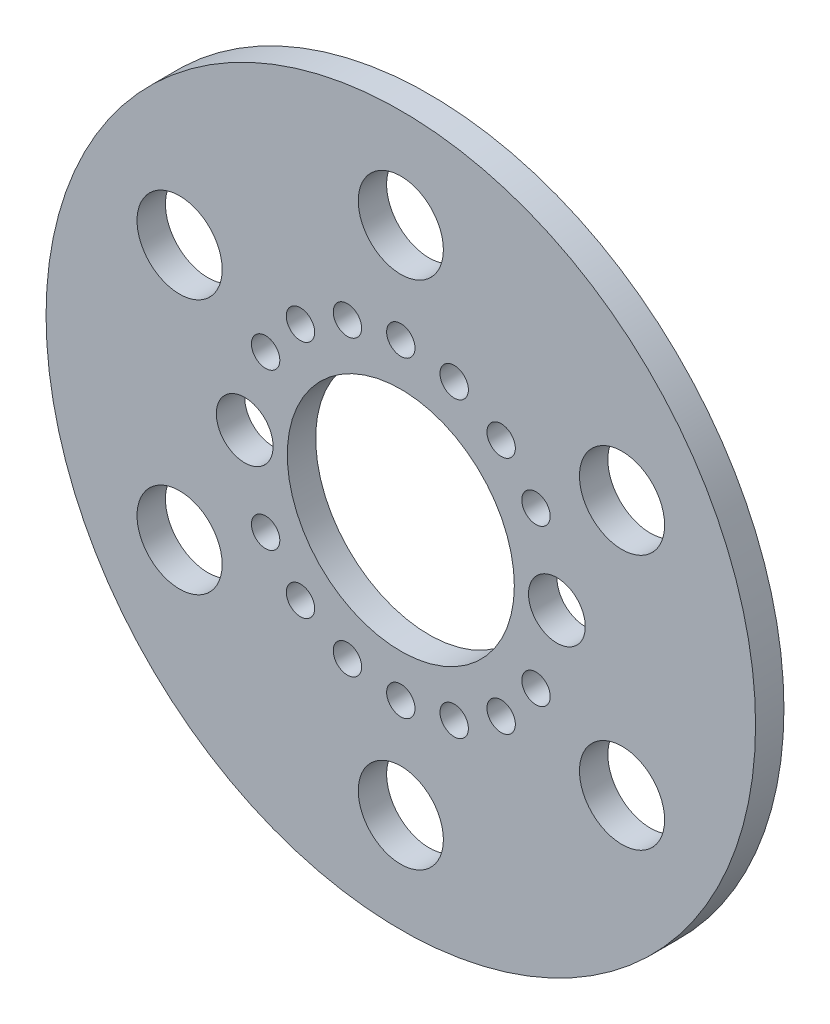
ISO-10303-21;
HEADER;
FILE_DESCRIPTION(('STEP AP214'),'2;1');
FILE_NAME('part.step','',(''),(''),'','','');
FILE_SCHEMA(('AUTOMOTIVE_DESIGN { 1 0 10303 214 1 1 1 1 }'));
ENDSEC;
DATA;
#1=APPLICATION_CONTEXT('core data for automotive mechanical design processes');
#2=APPLICATION_PROTOCOL_DEFINITION('international standard','automotive_design',2000,#1);
#3=PRODUCT_CONTEXT('',#1,'mechanical');
#4=PRODUCT('Part','Part','',(#3));
#5=PRODUCT_RELATED_PRODUCT_CATEGORY('part','',(#4));
#6=PRODUCT_DEFINITION_FORMATION('','',#4);
#7=PRODUCT_DEFINITION_CONTEXT('part definition',#1,'design');
#8=PRODUCT_DEFINITION('design','',#6,#7);
#9=PRODUCT_DEFINITION_SHAPE('','',#8);
#10=(LENGTH_UNIT() NAMED_UNIT(*) SI_UNIT(.MILLI.,.METRE.));
#11=(NAMED_UNIT(*) PLANE_ANGLE_UNIT() SI_UNIT($,.RADIAN.));
#12=(NAMED_UNIT(*) SI_UNIT($,.STERADIAN.) SOLID_ANGLE_UNIT());
#13=UNCERTAINTY_MEASURE_WITH_UNIT(LENGTH_MEASURE(1.E-05),#10,'distance_accuracy_value','');
#14=(GEOMETRIC_REPRESENTATION_CONTEXT(3) GLOBAL_UNCERTAINTY_ASSIGNED_CONTEXT((#13)) GLOBAL_UNIT_ASSIGNED_CONTEXT((#10,
#11,#12)) REPRESENTATION_CONTEXT('',''));
#15=CARTESIAN_POINT('',(0.,0.,0.));
#16=DIRECTION('',(0.,0.,1.));
#17=DIRECTION('',(1.,0.,0.));
#18=AXIS2_PLACEMENT_3D('',#15,#16,#17);
#19=CARTESIAN_POINT('',(0.,0.,1.));
#20=DIRECTION('',(0.,0.,1.));
#21=DIRECTION('',(1.,0.,0.));
#22=AXIS2_PLACEMENT_3D('',#19,#20,#21);
#23=PLANE('',#22);
#24=CARTESIAN_POINT('',(-3.53533185327562,4.21324443715342,1.));
#25=DIRECTION('',(0.,0.,1.));
#26=DIRECTION('',(1.,0.,0.));
#27=AXIS2_PLACEMENT_3D('',#24,#25,#26);
#28=CIRCLE('',#27,0.5);
#29=CARTESIAN_POINT('',(-3.03533185327562,4.21324443715342,1.));
#30=VERTEX_POINT('',#29);
#31=EDGE_CURVE('E171',#30,#30,#28,.T.);
#32=ORIENTED_EDGE('',*,*,#31,.F.);
#33=EDGE_LOOP('',(#32));
#34=FACE_BOUND('',#33,.T.);
#35=CARTESIAN_POINT('',(-4.76313972081219,-2.75000000000129,1.));
#36=DIRECTION('',(0.,0.,1.));
#37=DIRECTION('',(1.,0.,0.));
#38=AXIS2_PLACEMENT_3D('',#35,#36,#37);
#39=CIRCLE('',#38,0.500000000000001);
#40=CARTESIAN_POINT('',(-4.26313972081218,-2.75000000000129,1.));
#41=VERTEX_POINT('',#40);
#42=EDGE_CURVE('E159',#41,#41,#39,.T.);
#43=ORIENTED_EDGE('',*,*,#42,.F.);
#44=EDGE_LOOP('',(#43));
#45=FACE_BOUND('',#44,.T.);
#46=CARTESIAN_POINT('',(-1.8811107882883,-5.168309414323,1.));
#47=DIRECTION('',(0.,0.,1.));
#48=DIRECTION('',(1.,0.,0.));
#49=AXIS2_PLACEMENT_3D('',#46,#47,#48);
#50=CIRCLE('',#49,0.5);
#51=CARTESIAN_POINT('',(-1.3811107882883,-5.168309414323,1.));
#52=VERTEX_POINT('',#51);
#53=EDGE_CURVE('E147',#52,#52,#50,.T.);
#54=ORIENTED_EDGE('',*,*,#53,.F.);
#55=EDGE_LOOP('',(#54));
#56=FACE_BOUND('',#55,.T.);
#57=CARTESIAN_POINT('',(1.88111078829406,-5.16830941432199,1.));
#58=DIRECTION('',(0.,0.,1.));
#59=DIRECTION('',(1.,0.,0.));
#60=AXIS2_PLACEMENT_3D('',#57,#58,#59);
#61=CIRCLE('',#60,0.499999999999999);
#62=CARTESIAN_POINT('',(2.38111078829406,-5.16830941432199,1.));
#63=VERTEX_POINT('',#62);
#64=EDGE_CURVE('E135',#63,#63,#61,.T.);
#65=ORIENTED_EDGE('',*,*,#64,.F.);
#66=EDGE_LOOP('',(#65));
#67=FACE_BOUND('',#66,.T.);
#68=CARTESIAN_POINT('',(4.76313972081664,-2.74999999999871,1.));
#69=DIRECTION('',(0.,0.,1.));
#70=DIRECTION('',(1.,0.,0.));
#71=AXIS2_PLACEMENT_3D('',#68,#69,#70);
#72=CIRCLE('',#71,0.500000000000001);
#73=CARTESIAN_POINT('',(5.26313972081664,-2.74999999999871,1.));
#74=VERTEX_POINT('',#73);
#75=EDGE_CURVE('E123',#74,#74,#72,.T.);
#76=ORIENTED_EDGE('',*,*,#75,.F.);
#77=EDGE_LOOP('',(#76));
#78=FACE_BOUND('',#77,.T.);
#79=CARTESIAN_POINT('',(3.53533185327631,4.21324443715533,1.));
#80=DIRECTION('',(0.,0.,1.));
#81=DIRECTION('',(1.,0.,0.));
#82=AXIS2_PLACEMENT_3D('',#79,#80,#81);
#83=CIRCLE('',#82,0.5);
#84=CARTESIAN_POINT('',(4.03533185327631,4.21324443715533,1.));
#85=VERTEX_POINT('',#84);
#86=EDGE_CURVE('E111',#85,#85,#83,.T.);
#87=ORIENTED_EDGE('',*,*,#86,.F.);
#88=EDGE_LOOP('',(#87));
#89=FACE_BOUND('',#88,.T.);
#90=CARTESIAN_POINT('',(0.,5.5,1.));
#91=DIRECTION('',(0.,0.,1.));
#92=DIRECTION('',(1.,0.,0.));
#93=AXIS2_PLACEMENT_3D('',#90,#91,#92);
#94=CIRCLE('',#93,0.5);
#95=CARTESIAN_POINT('',(0.5,5.5,1.));
#96=VERTEX_POINT('',#95);
#97=EDGE_CURVE('E99',#96,#96,#94,.T.);
#98=ORIENTED_EDGE('',*,*,#97,.F.);
#99=EDGE_LOOP('',(#98));
#100=FACE_BOUND('',#99,.T.);
#101=CARTESIAN_POINT('',(-7.79422863405995,4.49999999999999,1.));
#102=DIRECTION('',(0.,0.,1.));
#103=DIRECTION('',(1.,0.,0.));
#104=AXIS2_PLACEMENT_3D('',#101,#102,#103);
#105=CIRCLE('',#104,1.50000000000011);
#106=CARTESIAN_POINT('',(-6.29422863405984,4.49999999999999,1.));
#107=VERTEX_POINT('',#106);
#108=EDGE_CURVE('E87',#107,#107,#105,.T.);
#109=ORIENTED_EDGE('',*,*,#108,.F.);
#110=EDGE_LOOP('',(#109));
#111=FACE_BOUND('',#110,.T.);
#112=CARTESIAN_POINT('',(0.,-9.,1.));
#113=DIRECTION('',(0.,0.,1.));
#114=DIRECTION('',(1.,0.,0.));
#115=AXIS2_PLACEMENT_3D('',#112,#113,#114);
#116=CIRCLE('',#115,1.50000000000006);
#117=CARTESIAN_POINT('',(1.50000000000006,-9.,1.));
#118=VERTEX_POINT('',#117);
#119=EDGE_CURVE('E75',#118,#118,#116,.T.);
#120=ORIENTED_EDGE('',*,*,#119,.F.);
#121=EDGE_LOOP('',(#120));
#122=FACE_BOUND('',#121,.T.);
#123=CARTESIAN_POINT('',(7.79422863405995,4.5,1.));
#124=DIRECTION('',(0.,0.,1.));
#125=DIRECTION('',(1.,0.,0.));
#126=AXIS2_PLACEMENT_3D('',#123,#124,#125);
#127=CIRCLE('',#126,1.50000000000002);
#128=CARTESIAN_POINT('',(9.29422863405997,4.5,1.));
#129=VERTEX_POINT('',#128);
#130=EDGE_CURVE('E63',#129,#129,#127,.T.);
#131=ORIENTED_EDGE('',*,*,#130,.F.);
#132=EDGE_LOOP('',(#131));
#133=FACE_BOUND('',#132,.T.);
#134=CARTESIAN_POINT('',(0.,9.,1.));
#135=DIRECTION('',(0.,0.,1.));
#136=DIRECTION('',(1.,0.,0.));
#137=AXIS2_PLACEMENT_3D('',#134,#135,#136);
#138=CIRCLE('',#137,1.5);
#139=CARTESIAN_POINT('',(1.5,9.,1.));
#140=VERTEX_POINT('',#139);
#141=EDGE_CURVE('E51',#140,#140,#138,.T.);
#142=ORIENTED_EDGE('',*,*,#141,.F.);
#143=EDGE_LOOP('',(#142));
#144=FACE_BOUND('',#143,.T.);
#145=CARTESIAN_POINT('',(0.,0.,1.));
#146=DIRECTION('',(0.,0.,1.));
#147=DIRECTION('',(1.,0.,0.));
#148=AXIS2_PLACEMENT_3D('',#145,#146,#147);
#149=CIRCLE('',#148,12.5);
#150=CARTESIAN_POINT('',(12.5,0.,1.));
#151=VERTEX_POINT('',#150);
#152=EDGE_CURVE('E10',#151,#151,#149,.T.);
#153=ORIENTED_EDGE('',*,*,#152,.T.);
#154=EDGE_LOOP('',(#153));
#155=FACE_BOUND('',#154,.T.);
#156=CARTESIAN_POINT('',(0.,0.,1.));
#157=DIRECTION('',(0.,0.,1.));
#158=DIRECTION('',(1.,0.,0.));
#159=AXIS2_PLACEMENT_3D('',#156,#157,#158);
#160=CIRCLE('',#159,4.);
#161=CARTESIAN_POINT('',(4.,0.,1.));
#162=VERTEX_POINT('',#161);
#163=EDGE_CURVE('E46',#162,#162,#160,.T.);
#164=ORIENTED_EDGE('',*,*,#163,.F.);
#165=EDGE_LOOP('',(#164));
#166=FACE_BOUND('',#165,.T.);
#167=CARTESIAN_POINT('',(-5.5,0.,1.));
#168=DIRECTION('',(0.,0.,1.));
#169=DIRECTION('',(1.,0.,0.));
#170=AXIS2_PLACEMENT_3D('',#167,#168,#169);
#171=CIRCLE('',#170,1.);
#172=CARTESIAN_POINT('',(-4.5,0.,1.));
#173=VERTEX_POINT('',#172);
#174=EDGE_CURVE('E57',#173,#173,#171,.T.);
#175=ORIENTED_EDGE('',*,*,#174,.F.);
#176=EDGE_LOOP('',(#175));
#177=FACE_BOUND('',#176,.T.);
#178=CARTESIAN_POINT('',(7.79422863405995,-4.5,1.));
#179=DIRECTION('',(0.,0.,1.));
#180=DIRECTION('',(1.,0.,0.));
#181=AXIS2_PLACEMENT_3D('',#178,#179,#180);
#182=CIRCLE('',#181,1.50000000000004);
#183=CARTESIAN_POINT('',(9.29422863405999,-4.5,1.));
#184=VERTEX_POINT('',#183);
#185=EDGE_CURVE('E69',#184,#184,#182,.T.);
#186=ORIENTED_EDGE('',*,*,#185,.F.);
#187=EDGE_LOOP('',(#186));
#188=FACE_BOUND('',#187,.T.);
#189=CARTESIAN_POINT('',(-7.79422863405994,-4.5,1.));
#190=DIRECTION('',(0.,0.,1.));
#191=DIRECTION('',(1.,0.,0.));
#192=AXIS2_PLACEMENT_3D('',#189,#190,#191);
#193=CIRCLE('',#192,1.50000000000008);
#194=CARTESIAN_POINT('',(-6.29422863405986,-4.5,1.));
#195=VERTEX_POINT('',#194);
#196=EDGE_CURVE('E81',#195,#195,#193,.T.);
#197=ORIENTED_EDGE('',*,*,#196,.F.);
#198=EDGE_LOOP('',(#197));
#199=FACE_BOUND('',#198,.T.);
#200=CARTESIAN_POINT('',(5.5,0.,1.));
#201=DIRECTION('',(0.,0.,1.));
#202=DIRECTION('',(-1.,0.,0.));
#203=AXIS2_PLACEMENT_3D('',#200,#201,#202);
#204=CIRCLE('',#203,1.);
#205=CARTESIAN_POINT('',(4.5,0.,1.));
#206=VERTEX_POINT('',#205);
#207=EDGE_CURVE('E93',#206,#206,#204,.T.);
#208=ORIENTED_EDGE('',*,*,#207,.F.);
#209=EDGE_LOOP('',(#208));
#210=FACE_BOUND('',#209,.T.);
#211=CARTESIAN_POINT('',(1.88111078829127,5.168309414323,1.));
#212=DIRECTION('',(0.,0.,1.));
#213=DIRECTION('',(1.,0.,0.));
#214=AXIS2_PLACEMENT_3D('',#211,#212,#213);
#215=CIRCLE('',#214,0.5);
#216=CARTESIAN_POINT('',(2.38111078829127,5.168309414323,1.));
#217=VERTEX_POINT('',#216);
#218=EDGE_CURVE('E105',#217,#217,#215,.T.);
#219=ORIENTED_EDGE('',*,*,#218,.F.);
#220=EDGE_LOOP('',(#219));
#221=FACE_BOUND('',#220,.T.);
#222=CARTESIAN_POINT('',(4.76313972081515,2.75000000000129,1.));
#223=DIRECTION('',(0.,0.,1.));
#224=DIRECTION('',(1.,0.,0.));
#225=AXIS2_PLACEMENT_3D('',#222,#223,#224);
#226=CIRCLE('',#225,0.500000000000001);
#227=CARTESIAN_POINT('',(5.26313972081515,2.75000000000129,1.));
#228=VERTEX_POINT('',#227);
#229=EDGE_CURVE('E117',#228,#228,#226,.T.);
#230=ORIENTED_EDGE('',*,*,#229,.F.);
#231=EDGE_LOOP('',(#230));
#232=FACE_BOUND('',#231,.T.);
#233=CARTESIAN_POINT('',(3.53533185327859,-4.21324443715342,1.));
#234=DIRECTION('',(0.,0.,1.));
#235=DIRECTION('',(1.,0.,0.));
#236=AXIS2_PLACEMENT_3D('',#233,#234,#235);
#237=CIRCLE('',#236,0.500000000000001);
#238=CARTESIAN_POINT('',(4.03533185327859,-4.21324443715342,1.));
#239=VERTEX_POINT('',#238);
#240=EDGE_CURVE('E129',#239,#239,#237,.T.);
#241=ORIENTED_EDGE('',*,*,#240,.F.);
#242=EDGE_LOOP('',(#241));
#243=FACE_BOUND('',#242,.T.);
#244=CARTESIAN_POINT('',(2.96872152399816E-12,-5.5,1.));
#245=DIRECTION('',(0.,0.,1.));
#246=DIRECTION('',(1.,0.,0.));
#247=AXIS2_PLACEMENT_3D('',#244,#245,#246);
#248=CIRCLE('',#247,0.5);
#249=CARTESIAN_POINT('',(0.500000000002969,-5.5,1.));
#250=VERTEX_POINT('',#249);
#251=EDGE_CURVE('E141',#250,#250,#248,.T.);
#252=ORIENTED_EDGE('',*,*,#251,.F.);
#253=EDGE_LOOP('',(#252));
#254=FACE_BOUND('',#253,.T.);
#255=CARTESIAN_POINT('',(-3.53533185327335,-4.21324443715533,1.));
#256=DIRECTION('',(0.,0.,1.));
#257=DIRECTION('',(1.,0.,0.));
#258=AXIS2_PLACEMENT_3D('',#255,#256,#257);
#259=CIRCLE('',#258,0.5);
#260=CARTESIAN_POINT('',(-3.03533185327335,-4.21324443715533,1.));
#261=VERTEX_POINT('',#260);
#262=EDGE_CURVE('E153',#261,#261,#259,.T.);
#263=ORIENTED_EDGE('',*,*,#262,.F.);
#264=EDGE_LOOP('',(#263));
#265=FACE_BOUND('',#264,.T.);
#266=CARTESIAN_POINT('',(-4.76313972081367,2.74999999999872,1.));
#267=DIRECTION('',(0.,0.,1.));
#268=DIRECTION('',(1.,0.,0.));
#269=AXIS2_PLACEMENT_3D('',#266,#267,#268);
#270=CIRCLE('',#269,0.500000000000001);
#271=CARTESIAN_POINT('',(-4.26313972081367,2.74999999999872,1.));
#272=VERTEX_POINT('',#271);
#273=EDGE_CURVE('E165',#272,#272,#270,.T.);
#274=ORIENTED_EDGE('',*,*,#273,.F.);
#275=EDGE_LOOP('',(#274));
#276=FACE_BOUND('',#275,.T.);
#277=CARTESIAN_POINT('',(-1.88111078829109,5.16830941432199,1.));
#278=DIRECTION('',(0.,0.,1.));
#279=DIRECTION('',(1.,0.,0.));
#280=AXIS2_PLACEMENT_3D('',#277,#278,#279);
#281=CIRCLE('',#280,0.5);
#282=CARTESIAN_POINT('',(-1.38111078829109,5.16830941432199,1.));
#283=VERTEX_POINT('',#282);
#284=EDGE_CURVE('E177',#283,#283,#281,.T.);
#285=ORIENTED_EDGE('',*,*,#284,.F.);
#286=EDGE_LOOP('',(#285));
#287=FACE_BOUND('',#286,.T.);
#288=ADVANCED_FACE('F35',(#34,#45,#56,#67,#78,#89,#100,#111,#122,#133,#144,#155,#166,#177,#188,
#199,#210,#221,#232,#243,#254,#265,#276,#287),#23,.T.);
#289=CARTESIAN_POINT('',(0.,0.,0.));
#290=DIRECTION('',(0.,0.,1.));
#291=DIRECTION('',(1.,0.,0.));
#292=AXIS2_PLACEMENT_3D('',#289,#290,#291);
#293=PLANE('',#292);
#294=CARTESIAN_POINT('',(0.,0.,0.));
#295=DIRECTION('',(0.,0.,1.));
#296=DIRECTION('',(1.,0.,0.));
#297=AXIS2_PLACEMENT_3D('',#294,#295,#296);
#298=CIRCLE('',#297,12.5);
#299=CARTESIAN_POINT('',(12.5,0.,0.));
#300=VERTEX_POINT('',#299);
#301=EDGE_CURVE('E39',#300,#300,#298,.T.);
#302=ORIENTED_EDGE('',*,*,#301,.F.);
#303=EDGE_LOOP('',(#302));
#304=FACE_BOUND('',#303,.T.);
#305=CARTESIAN_POINT('',(0.,0.,0.));
#306=DIRECTION('',(0.,0.,1.));
#307=DIRECTION('',(1.,0.,0.));
#308=AXIS2_PLACEMENT_3D('',#305,#306,#307);
#309=CIRCLE('',#308,4.);
#310=CARTESIAN_POINT('',(4.,0.,0.));
#311=VERTEX_POINT('',#310);
#312=EDGE_CURVE('E48',#311,#311,#309,.T.);
#313=ORIENTED_EDGE('',*,*,#312,.T.);
#314=EDGE_LOOP('',(#313));
#315=FACE_BOUND('',#314,.T.);
#316=CARTESIAN_POINT('',(0.,9.,0.));
#317=DIRECTION('',(0.,0.,1.));
#318=DIRECTION('',(1.,0.,0.));
#319=AXIS2_PLACEMENT_3D('',#316,#317,#318);
#320=CIRCLE('',#319,1.5);
#321=CARTESIAN_POINT('',(1.5,9.,0.));
#322=VERTEX_POINT('',#321);
#323=EDGE_CURVE('E54',#322,#322,#320,.T.);
#324=ORIENTED_EDGE('',*,*,#323,.T.);
#325=EDGE_LOOP('',(#324));
#326=FACE_BOUND('',#325,.T.);
#327=CARTESIAN_POINT('',(-5.5,0.,0.));
#328=DIRECTION('',(0.,0.,1.));
#329=DIRECTION('',(1.,0.,0.));
#330=AXIS2_PLACEMENT_3D('',#327,#328,#329);
#331=CIRCLE('',#330,1.);
#332=CARTESIAN_POINT('',(-4.5,0.,0.));
#333=VERTEX_POINT('',#332);
#334=EDGE_CURVE('E60',#333,#333,#331,.T.);
#335=ORIENTED_EDGE('',*,*,#334,.T.);
#336=EDGE_LOOP('',(#335));
#337=FACE_BOUND('',#336,.T.);
#338=CARTESIAN_POINT('',(7.79422863405995,4.5,0.));
#339=DIRECTION('',(0.,0.,1.));
#340=DIRECTION('',(1.,0.,0.));
#341=AXIS2_PLACEMENT_3D('',#338,#339,#340);
#342=CIRCLE('',#341,1.50000000000002);
#343=CARTESIAN_POINT('',(9.29422863405997,4.5,0.));
#344=VERTEX_POINT('',#343);
#345=EDGE_CURVE('E66',#344,#344,#342,.T.);
#346=ORIENTED_EDGE('',*,*,#345,.T.);
#347=EDGE_LOOP('',(#346));
#348=FACE_BOUND('',#347,.T.);
#349=CARTESIAN_POINT('',(7.79422863405995,-4.5,0.));
#350=DIRECTION('',(0.,0.,1.));
#351=DIRECTION('',(1.,0.,0.));
#352=AXIS2_PLACEMENT_3D('',#349,#350,#351);
#353=CIRCLE('',#352,1.50000000000004);
#354=CARTESIAN_POINT('',(9.29422863405999,-4.5,0.));
#355=VERTEX_POINT('',#354);
#356=EDGE_CURVE('E72',#355,#355,#353,.T.);
#357=ORIENTED_EDGE('',*,*,#356,.T.);
#358=EDGE_LOOP('',(#357));
#359=FACE_BOUND('',#358,.T.);
#360=CARTESIAN_POINT('',(0.,-9.,0.));
#361=DIRECTION('',(0.,0.,1.));
#362=DIRECTION('',(1.,0.,0.));
#363=AXIS2_PLACEMENT_3D('',#360,#361,#362);
#364=CIRCLE('',#363,1.50000000000006);
#365=CARTESIAN_POINT('',(1.50000000000006,-9.,0.));
#366=VERTEX_POINT('',#365);
#367=EDGE_CURVE('E78',#366,#366,#364,.T.);
#368=ORIENTED_EDGE('',*,*,#367,.T.);
#369=EDGE_LOOP('',(#368));
#370=FACE_BOUND('',#369,.T.);
#371=CARTESIAN_POINT('',(-7.79422863405994,-4.5,0.));
#372=DIRECTION('',(0.,0.,1.));
#373=DIRECTION('',(1.,0.,0.));
#374=AXIS2_PLACEMENT_3D('',#371,#372,#373);
#375=CIRCLE('',#374,1.50000000000008);
#376=CARTESIAN_POINT('',(-6.29422863405986,-4.5,0.));
#377=VERTEX_POINT('',#376);
#378=EDGE_CURVE('E84',#377,#377,#375,.T.);
#379=ORIENTED_EDGE('',*,*,#378,.T.);
#380=EDGE_LOOP('',(#379));
#381=FACE_BOUND('',#380,.T.);
#382=CARTESIAN_POINT('',(-7.79422863405995,4.49999999999999,0.));
#383=DIRECTION('',(0.,0.,1.));
#384=DIRECTION('',(1.,0.,0.));
#385=AXIS2_PLACEMENT_3D('',#382,#383,#384);
#386=CIRCLE('',#385,1.50000000000011);
#387=CARTESIAN_POINT('',(-6.29422863405984,4.49999999999999,0.));
#388=VERTEX_POINT('',#387);
#389=EDGE_CURVE('E90',#388,#388,#386,.T.);
#390=ORIENTED_EDGE('',*,*,#389,.T.);
#391=EDGE_LOOP('',(#390));
#392=FACE_BOUND('',#391,.T.);
#393=CARTESIAN_POINT('',(5.5,0.,0.));
#394=DIRECTION('',(0.,0.,1.));
#395=DIRECTION('',(-1.,0.,0.));
#396=AXIS2_PLACEMENT_3D('',#393,#394,#395);
#397=CIRCLE('',#396,1.);
#398=CARTESIAN_POINT('',(4.5,0.,0.));
#399=VERTEX_POINT('',#398);
#400=EDGE_CURVE('E96',#399,#399,#397,.T.);
#401=ORIENTED_EDGE('',*,*,#400,.T.);
#402=EDGE_LOOP('',(#401));
#403=FACE_BOUND('',#402,.T.);
#404=CARTESIAN_POINT('',(0.,5.5,0.));
#405=DIRECTION('',(0.,0.,1.));
#406=DIRECTION('',(1.,0.,0.));
#407=AXIS2_PLACEMENT_3D('',#404,#405,#406);
#408=CIRCLE('',#407,0.5);
#409=CARTESIAN_POINT('',(0.5,5.5,0.));
#410=VERTEX_POINT('',#409);
#411=EDGE_CURVE('E102',#410,#410,#408,.T.);
#412=ORIENTED_EDGE('',*,*,#411,.T.);
#413=EDGE_LOOP('',(#412));
#414=FACE_BOUND('',#413,.T.);
#415=CARTESIAN_POINT('',(1.88111078829127,5.168309414323,0.));
#416=DIRECTION('',(0.,0.,1.));
#417=DIRECTION('',(1.,0.,0.));
#418=AXIS2_PLACEMENT_3D('',#415,#416,#417);
#419=CIRCLE('',#418,0.5);
#420=CARTESIAN_POINT('',(2.38111078829127,5.168309414323,0.));
#421=VERTEX_POINT('',#420);
#422=EDGE_CURVE('E108',#421,#421,#419,.T.);
#423=ORIENTED_EDGE('',*,*,#422,.T.);
#424=EDGE_LOOP('',(#423));
#425=FACE_BOUND('',#424,.T.);
#426=CARTESIAN_POINT('',(3.53533185327631,4.21324443715533,0.));
#427=DIRECTION('',(0.,0.,1.));
#428=DIRECTION('',(1.,0.,0.));
#429=AXIS2_PLACEMENT_3D('',#426,#427,#428);
#430=CIRCLE('',#429,0.5);
#431=CARTESIAN_POINT('',(4.03533185327631,4.21324443715533,0.));
#432=VERTEX_POINT('',#431);
#433=EDGE_CURVE('E114',#432,#432,#430,.T.);
#434=ORIENTED_EDGE('',*,*,#433,.T.);
#435=EDGE_LOOP('',(#434));
#436=FACE_BOUND('',#435,.T.);
#437=CARTESIAN_POINT('',(4.76313972081515,2.75000000000129,0.));
#438=DIRECTION('',(0.,0.,1.));
#439=DIRECTION('',(1.,0.,0.));
#440=AXIS2_PLACEMENT_3D('',#437,#438,#439);
#441=CIRCLE('',#440,0.500000000000001);
#442=CARTESIAN_POINT('',(5.26313972081515,2.75000000000129,0.));
#443=VERTEX_POINT('',#442);
#444=EDGE_CURVE('E120',#443,#443,#441,.T.);
#445=ORIENTED_EDGE('',*,*,#444,.T.);
#446=EDGE_LOOP('',(#445));
#447=FACE_BOUND('',#446,.T.);
#448=CARTESIAN_POINT('',(4.76313972081664,-2.74999999999871,0.));
#449=DIRECTION('',(0.,0.,1.));
#450=DIRECTION('',(1.,0.,0.));
#451=AXIS2_PLACEMENT_3D('',#448,#449,#450);
#452=CIRCLE('',#451,0.500000000000001);
#453=CARTESIAN_POINT('',(5.26313972081664,-2.74999999999871,0.));
#454=VERTEX_POINT('',#453);
#455=EDGE_CURVE('E126',#454,#454,#452,.T.);
#456=ORIENTED_EDGE('',*,*,#455,.T.);
#457=EDGE_LOOP('',(#456));
#458=FACE_BOUND('',#457,.T.);
#459=CARTESIAN_POINT('',(3.53533185327859,-4.21324443715342,0.));
#460=DIRECTION('',(0.,0.,1.));
#461=DIRECTION('',(1.,0.,0.));
#462=AXIS2_PLACEMENT_3D('',#459,#460,#461);
#463=CIRCLE('',#462,0.500000000000001);
#464=CARTESIAN_POINT('',(4.03533185327859,-4.21324443715342,0.));
#465=VERTEX_POINT('',#464);
#466=EDGE_CURVE('E132',#465,#465,#463,.T.);
#467=ORIENTED_EDGE('',*,*,#466,.T.);
#468=EDGE_LOOP('',(#467));
#469=FACE_BOUND('',#468,.T.);
#470=CARTESIAN_POINT('',(1.88111078829406,-5.16830941432199,0.));
#471=DIRECTION('',(0.,0.,1.));
#472=DIRECTION('',(1.,0.,0.));
#473=AXIS2_PLACEMENT_3D('',#470,#471,#472);
#474=CIRCLE('',#473,0.499999999999999);
#475=CARTESIAN_POINT('',(2.38111078829406,-5.16830941432199,0.));
#476=VERTEX_POINT('',#475);
#477=EDGE_CURVE('E138',#476,#476,#474,.T.);
#478=ORIENTED_EDGE('',*,*,#477,.T.);
#479=EDGE_LOOP('',(#478));
#480=FACE_BOUND('',#479,.T.);
#481=CARTESIAN_POINT('',(2.96872152399816E-12,-5.5,0.));
#482=DIRECTION('',(0.,0.,1.));
#483=DIRECTION('',(1.,0.,0.));
#484=AXIS2_PLACEMENT_3D('',#481,#482,#483);
#485=CIRCLE('',#484,0.5);
#486=CARTESIAN_POINT('',(0.500000000002969,-5.5,0.));
#487=VERTEX_POINT('',#486);
#488=EDGE_CURVE('E144',#487,#487,#485,.T.);
#489=ORIENTED_EDGE('',*,*,#488,.T.);
#490=EDGE_LOOP('',(#489));
#491=FACE_BOUND('',#490,.T.);
#492=CARTESIAN_POINT('',(-1.8811107882883,-5.168309414323,0.));
#493=DIRECTION('',(0.,0.,1.));
#494=DIRECTION('',(1.,0.,0.));
#495=AXIS2_PLACEMENT_3D('',#492,#493,#494);
#496=CIRCLE('',#495,0.5);
#497=CARTESIAN_POINT('',(-1.3811107882883,-5.168309414323,0.));
#498=VERTEX_POINT('',#497);
#499=EDGE_CURVE('E150',#498,#498,#496,.T.);
#500=ORIENTED_EDGE('',*,*,#499,.T.);
#501=EDGE_LOOP('',(#500));
#502=FACE_BOUND('',#501,.T.);
#503=CARTESIAN_POINT('',(-3.53533185327335,-4.21324443715533,0.));
#504=DIRECTION('',(0.,0.,1.));
#505=DIRECTION('',(1.,0.,0.));
#506=AXIS2_PLACEMENT_3D('',#503,#504,#505);
#507=CIRCLE('',#506,0.5);
#508=CARTESIAN_POINT('',(-3.03533185327335,-4.21324443715533,0.));
#509=VERTEX_POINT('',#508);
#510=EDGE_CURVE('E156',#509,#509,#507,.T.);
#511=ORIENTED_EDGE('',*,*,#510,.T.);
#512=EDGE_LOOP('',(#511));
#513=FACE_BOUND('',#512,.T.);
#514=CARTESIAN_POINT('',(-4.76313972081219,-2.75000000000129,0.));
#515=DIRECTION('',(0.,0.,1.));
#516=DIRECTION('',(1.,0.,0.));
#517=AXIS2_PLACEMENT_3D('',#514,#515,#516);
#518=CIRCLE('',#517,0.500000000000001);
#519=CARTESIAN_POINT('',(-4.26313972081218,-2.75000000000129,0.));
#520=VERTEX_POINT('',#519);
#521=EDGE_CURVE('E162',#520,#520,#518,.T.);
#522=ORIENTED_EDGE('',*,*,#521,.T.);
#523=EDGE_LOOP('',(#522));
#524=FACE_BOUND('',#523,.T.);
#525=CARTESIAN_POINT('',(-4.76313972081367,2.74999999999872,0.));
#526=DIRECTION('',(0.,0.,1.));
#527=DIRECTION('',(1.,0.,0.));
#528=AXIS2_PLACEMENT_3D('',#525,#526,#527);
#529=CIRCLE('',#528,0.500000000000001);
#530=CARTESIAN_POINT('',(-4.26313972081367,2.74999999999872,0.));
#531=VERTEX_POINT('',#530);
#532=EDGE_CURVE('E168',#531,#531,#529,.T.);
#533=ORIENTED_EDGE('',*,*,#532,.T.);
#534=EDGE_LOOP('',(#533));
#535=FACE_BOUND('',#534,.T.);
#536=CARTESIAN_POINT('',(-3.53533185327562,4.21324443715342,0.));
#537=DIRECTION('',(0.,0.,1.));
#538=DIRECTION('',(1.,0.,0.));
#539=AXIS2_PLACEMENT_3D('',#536,#537,#538);
#540=CIRCLE('',#539,0.5);
#541=CARTESIAN_POINT('',(-3.03533185327562,4.21324443715342,0.));
#542=VERTEX_POINT('',#541);
#543=EDGE_CURVE('E174',#542,#542,#540,.T.);
#544=ORIENTED_EDGE('',*,*,#543,.T.);
#545=EDGE_LOOP('',(#544));
#546=FACE_BOUND('',#545,.T.);
#547=CARTESIAN_POINT('',(-1.88111078829109,5.16830941432199,0.));
#548=DIRECTION('',(0.,0.,1.));
#549=DIRECTION('',(1.,0.,0.));
#550=AXIS2_PLACEMENT_3D('',#547,#548,#549);
#551=CIRCLE('',#550,0.5);
#552=CARTESIAN_POINT('',(-1.38111078829109,5.16830941432199,0.));
#553=VERTEX_POINT('',#552);
#554=EDGE_CURVE('E180',#553,#553,#551,.T.);
#555=ORIENTED_EDGE('',*,*,#554,.T.);
#556=EDGE_LOOP('',(#555));
#557=FACE_BOUND('',#556,.T.);
#558=ADVANCED_FACE('F190',(#304,#315,#326,#337,#348,#359,#370,#381,#392,#403,#414,#425,#436,
#447,#458,#469,#480,#491,#502,#513,#524,#535,#546,#557),#293,.F.);
#559=CARTESIAN_POINT('',(0.,0.,1.));
#560=DIRECTION('',(0.,0.,-1.));
#561=DIRECTION('',(-1.,0.,0.));
#562=AXIS2_PLACEMENT_3D('',#559,#560,#561);
#563=CYLINDRICAL_SURFACE('',#562,12.5);
#564=ORIENTED_EDGE('',*,*,#152,.F.);
#565=EDGE_LOOP('',(#564));
#566=FACE_BOUND('',#565,.T.);
#567=ORIENTED_EDGE('',*,*,#301,.T.);
#568=EDGE_LOOP('',(#567));
#569=FACE_BOUND('',#568,.T.);
#570=ADVANCED_FACE('F37',(#566,#569),#563,.T.);
#571=CARTESIAN_POINT('',(0.,0.,1.));
#572=DIRECTION('',(0.,0.,-1.));
#573=DIRECTION('',(-1.,0.,0.));
#574=AXIS2_PLACEMENT_3D('',#571,#572,#573);
#575=CYLINDRICAL_SURFACE('',#574,4.);
#576=ORIENTED_EDGE('',*,*,#163,.T.);
#577=EDGE_LOOP('',(#576));
#578=FACE_BOUND('',#577,.T.);
#579=ORIENTED_EDGE('',*,*,#312,.F.);
#580=EDGE_LOOP('',(#579));
#581=FACE_BOUND('',#580,.T.);
#582=ADVANCED_FACE('F200',(#578,#581),#575,.F.);
#583=CARTESIAN_POINT('',(0.,9.,1.));
#584=DIRECTION('',(0.,0.,-1.));
#585=DIRECTION('',(-1.,0.,0.));
#586=AXIS2_PLACEMENT_3D('',#583,#584,#585);
#587=CYLINDRICAL_SURFACE('',#586,1.5);
#588=ORIENTED_EDGE('',*,*,#141,.T.);
#589=EDGE_LOOP('',(#588));
#590=FACE_BOUND('',#589,.T.);
#591=ORIENTED_EDGE('',*,*,#323,.F.);
#592=EDGE_LOOP('',(#591));
#593=FACE_BOUND('',#592,.T.);
#594=ADVANCED_FACE('F203',(#590,#593),#587,.F.);
#595=CARTESIAN_POINT('',(-5.5,0.,1.));
#596=DIRECTION('',(0.,0.,-1.));
#597=DIRECTION('',(-1.,0.,0.));
#598=AXIS2_PLACEMENT_3D('',#595,#596,#597);
#599=CYLINDRICAL_SURFACE('',#598,1.);
#600=ORIENTED_EDGE('',*,*,#174,.T.);
#601=EDGE_LOOP('',(#600));
#602=FACE_BOUND('',#601,.T.);
#603=ORIENTED_EDGE('',*,*,#334,.F.);
#604=EDGE_LOOP('',(#603));
#605=FACE_BOUND('',#604,.T.);
#606=ADVANCED_FACE('F207',(#602,#605),#599,.F.);
#607=CARTESIAN_POINT('',(7.79422863405995,4.5,1.));
#608=DIRECTION('',(0.,0.,-1.));
#609=DIRECTION('',(-1.,0.,0.));
#610=AXIS2_PLACEMENT_3D('',#607,#608,#609);
#611=CYLINDRICAL_SURFACE('',#610,1.50000000000002);
#612=ORIENTED_EDGE('',*,*,#130,.T.);
#613=EDGE_LOOP('',(#612));
#614=FACE_BOUND('',#613,.T.);
#615=ORIENTED_EDGE('',*,*,#345,.F.);
#616=EDGE_LOOP('',(#615));
#617=FACE_BOUND('',#616,.T.);
#618=ADVANCED_FACE('F211',(#614,#617),#611,.F.);
#619=CARTESIAN_POINT('',(7.79422863405995,-4.5,1.));
#620=DIRECTION('',(0.,0.,-1.));
#621=DIRECTION('',(-1.,0.,0.));
#622=AXIS2_PLACEMENT_3D('',#619,#620,#621);
#623=CYLINDRICAL_SURFACE('',#622,1.50000000000004);
#624=ORIENTED_EDGE('',*,*,#185,.T.);
#625=EDGE_LOOP('',(#624));
#626=FACE_BOUND('',#625,.T.);
#627=ORIENTED_EDGE('',*,*,#356,.F.);
#628=EDGE_LOOP('',(#627));
#629=FACE_BOUND('',#628,.T.);
#630=ADVANCED_FACE('F215',(#626,#629),#623,.F.);
#631=CARTESIAN_POINT('',(0.,-9.,1.));
#632=DIRECTION('',(0.,0.,-1.));
#633=DIRECTION('',(-1.,0.,0.));
#634=AXIS2_PLACEMENT_3D('',#631,#632,#633);
#635=CYLINDRICAL_SURFACE('',#634,1.50000000000006);
#636=ORIENTED_EDGE('',*,*,#119,.T.);
#637=EDGE_LOOP('',(#636));
#638=FACE_BOUND('',#637,.T.);
#639=ORIENTED_EDGE('',*,*,#367,.F.);
#640=EDGE_LOOP('',(#639));
#641=FACE_BOUND('',#640,.T.);
#642=ADVANCED_FACE('F219',(#638,#641),#635,.F.);
#643=CARTESIAN_POINT('',(-7.79422863405994,-4.5,1.));
#644=DIRECTION('',(0.,0.,-1.));
#645=DIRECTION('',(-1.,0.,0.));
#646=AXIS2_PLACEMENT_3D('',#643,#644,#645);
#647=CYLINDRICAL_SURFACE('',#646,1.50000000000008);
#648=ORIENTED_EDGE('',*,*,#196,.T.);
#649=EDGE_LOOP('',(#648));
#650=FACE_BOUND('',#649,.T.);
#651=ORIENTED_EDGE('',*,*,#378,.F.);
#652=EDGE_LOOP('',(#651));
#653=FACE_BOUND('',#652,.T.);
#654=ADVANCED_FACE('F223',(#650,#653),#647,.F.);
#655=CARTESIAN_POINT('',(-7.79422863405995,4.49999999999999,1.));
#656=DIRECTION('',(0.,0.,-1.));
#657=DIRECTION('',(-1.,0.,0.));
#658=AXIS2_PLACEMENT_3D('',#655,#656,#657);
#659=CYLINDRICAL_SURFACE('',#658,1.50000000000011);
#660=ORIENTED_EDGE('',*,*,#108,.T.);
#661=EDGE_LOOP('',(#660));
#662=FACE_BOUND('',#661,.T.);
#663=ORIENTED_EDGE('',*,*,#389,.F.);
#664=EDGE_LOOP('',(#663));
#665=FACE_BOUND('',#664,.T.);
#666=ADVANCED_FACE('F227',(#662,#665),#659,.F.);
#667=CARTESIAN_POINT('',(5.5,0.,1.));
#668=DIRECTION('',(0.,0.,-1.));
#669=DIRECTION('',(-1.,0.,0.));
#670=AXIS2_PLACEMENT_3D('',#667,#668,#669);
#671=CYLINDRICAL_SURFACE('',#670,1.);
#672=ORIENTED_EDGE('',*,*,#207,.T.);
#673=EDGE_LOOP('',(#672));
#674=FACE_BOUND('',#673,.T.);
#675=ORIENTED_EDGE('',*,*,#400,.F.);
#676=EDGE_LOOP('',(#675));
#677=FACE_BOUND('',#676,.T.);
#678=ADVANCED_FACE('F231',(#674,#677),#671,.F.);
#679=CARTESIAN_POINT('',(0.,5.5,1.));
#680=DIRECTION('',(0.,0.,-1.));
#681=DIRECTION('',(-1.,0.,0.));
#682=AXIS2_PLACEMENT_3D('',#679,#680,#681);
#683=CYLINDRICAL_SURFACE('',#682,0.5);
#684=ORIENTED_EDGE('',*,*,#97,.T.);
#685=EDGE_LOOP('',(#684));
#686=FACE_BOUND('',#685,.T.);
#687=ORIENTED_EDGE('',*,*,#411,.F.);
#688=EDGE_LOOP('',(#687));
#689=FACE_BOUND('',#688,.T.);
#690=ADVANCED_FACE('F235',(#686,#689),#683,.F.);
#691=CARTESIAN_POINT('',(1.88111078829127,5.168309414323,1.));
#692=DIRECTION('',(0.,0.,-1.));
#693=DIRECTION('',(-1.,0.,0.));
#694=AXIS2_PLACEMENT_3D('',#691,#692,#693);
#695=CYLINDRICAL_SURFACE('',#694,0.5);
#696=ORIENTED_EDGE('',*,*,#218,.T.);
#697=EDGE_LOOP('',(#696));
#698=FACE_BOUND('',#697,.T.);
#699=ORIENTED_EDGE('',*,*,#422,.F.);
#700=EDGE_LOOP('',(#699));
#701=FACE_BOUND('',#700,.T.);
#702=ADVANCED_FACE('F239',(#698,#701),#695,.F.);
#703=CARTESIAN_POINT('',(3.53533185327631,4.21324443715533,1.));
#704=DIRECTION('',(0.,0.,-1.));
#705=DIRECTION('',(-1.,0.,0.));
#706=AXIS2_PLACEMENT_3D('',#703,#704,#705);
#707=CYLINDRICAL_SURFACE('',#706,0.5);
#708=ORIENTED_EDGE('',*,*,#86,.T.);
#709=EDGE_LOOP('',(#708));
#710=FACE_BOUND('',#709,.T.);
#711=ORIENTED_EDGE('',*,*,#433,.F.);
#712=EDGE_LOOP('',(#711));
#713=FACE_BOUND('',#712,.T.);
#714=ADVANCED_FACE('F243',(#710,#713),#707,.F.);
#715=CARTESIAN_POINT('',(4.76313972081515,2.75000000000129,1.));
#716=DIRECTION('',(0.,0.,-1.));
#717=DIRECTION('',(-1.,0.,0.));
#718=AXIS2_PLACEMENT_3D('',#715,#716,#717);
#719=CYLINDRICAL_SURFACE('',#718,0.500000000000001);
#720=ORIENTED_EDGE('',*,*,#229,.T.);
#721=EDGE_LOOP('',(#720));
#722=FACE_BOUND('',#721,.T.);
#723=ORIENTED_EDGE('',*,*,#444,.F.);
#724=EDGE_LOOP('',(#723));
#725=FACE_BOUND('',#724,.T.);
#726=ADVANCED_FACE('F247',(#722,#725),#719,.F.);
#727=CARTESIAN_POINT('',(4.76313972081664,-2.74999999999871,1.));
#728=DIRECTION('',(0.,0.,-1.));
#729=DIRECTION('',(-1.,0.,0.));
#730=AXIS2_PLACEMENT_3D('',#727,#728,#729);
#731=CYLINDRICAL_SURFACE('',#730,0.500000000000001);
#732=ORIENTED_EDGE('',*,*,#75,.T.);
#733=EDGE_LOOP('',(#732));
#734=FACE_BOUND('',#733,.T.);
#735=ORIENTED_EDGE('',*,*,#455,.F.);
#736=EDGE_LOOP('',(#735));
#737=FACE_BOUND('',#736,.T.);
#738=ADVANCED_FACE('F251',(#734,#737),#731,.F.);
#739=CARTESIAN_POINT('',(3.53533185327859,-4.21324443715342,1.));
#740=DIRECTION('',(0.,0.,-1.));
#741=DIRECTION('',(-1.,0.,0.));
#742=AXIS2_PLACEMENT_3D('',#739,#740,#741);
#743=CYLINDRICAL_SURFACE('',#742,0.500000000000001);
#744=ORIENTED_EDGE('',*,*,#240,.T.);
#745=EDGE_LOOP('',(#744));
#746=FACE_BOUND('',#745,.T.);
#747=ORIENTED_EDGE('',*,*,#466,.F.);
#748=EDGE_LOOP('',(#747));
#749=FACE_BOUND('',#748,.T.);
#750=ADVANCED_FACE('F255',(#746,#749),#743,.F.);
#751=CARTESIAN_POINT('',(1.88111078829406,-5.16830941432199,1.));
#752=DIRECTION('',(0.,0.,-1.));
#753=DIRECTION('',(-1.,0.,0.));
#754=AXIS2_PLACEMENT_3D('',#751,#752,#753);
#755=CYLINDRICAL_SURFACE('',#754,0.499999999999999);
#756=ORIENTED_EDGE('',*,*,#64,.T.);
#757=EDGE_LOOP('',(#756));
#758=FACE_BOUND('',#757,.T.);
#759=ORIENTED_EDGE('',*,*,#477,.F.);
#760=EDGE_LOOP('',(#759));
#761=FACE_BOUND('',#760,.T.);
#762=ADVANCED_FACE('F259',(#758,#761),#755,.F.);
#763=CARTESIAN_POINT('',(2.96872152399816E-12,-5.5,1.));
#764=DIRECTION('',(0.,0.,-1.));
#765=DIRECTION('',(-1.,0.,0.));
#766=AXIS2_PLACEMENT_3D('',#763,#764,#765);
#767=CYLINDRICAL_SURFACE('',#766,0.5);
#768=ORIENTED_EDGE('',*,*,#251,.T.);
#769=EDGE_LOOP('',(#768));
#770=FACE_BOUND('',#769,.T.);
#771=ORIENTED_EDGE('',*,*,#488,.F.);
#772=EDGE_LOOP('',(#771));
#773=FACE_BOUND('',#772,.T.);
#774=ADVANCED_FACE('F263',(#770,#773),#767,.F.);
#775=CARTESIAN_POINT('',(-1.8811107882883,-5.168309414323,1.));
#776=DIRECTION('',(0.,0.,-1.));
#777=DIRECTION('',(-1.,0.,0.));
#778=AXIS2_PLACEMENT_3D('',#775,#776,#777);
#779=CYLINDRICAL_SURFACE('',#778,0.5);
#780=ORIENTED_EDGE('',*,*,#53,.T.);
#781=EDGE_LOOP('',(#780));
#782=FACE_BOUND('',#781,.T.);
#783=ORIENTED_EDGE('',*,*,#499,.F.);
#784=EDGE_LOOP('',(#783));
#785=FACE_BOUND('',#784,.T.);
#786=ADVANCED_FACE('F267',(#782,#785),#779,.F.);
#787=CARTESIAN_POINT('',(-3.53533185327335,-4.21324443715533,1.));
#788=DIRECTION('',(0.,0.,-1.));
#789=DIRECTION('',(-1.,0.,0.));
#790=AXIS2_PLACEMENT_3D('',#787,#788,#789);
#791=CYLINDRICAL_SURFACE('',#790,0.5);
#792=ORIENTED_EDGE('',*,*,#262,.T.);
#793=EDGE_LOOP('',(#792));
#794=FACE_BOUND('',#793,.T.);
#795=ORIENTED_EDGE('',*,*,#510,.F.);
#796=EDGE_LOOP('',(#795));
#797=FACE_BOUND('',#796,.T.);
#798=ADVANCED_FACE('F271',(#794,#797),#791,.F.);
#799=CARTESIAN_POINT('',(-4.76313972081219,-2.75000000000129,1.));
#800=DIRECTION('',(0.,0.,-1.));
#801=DIRECTION('',(-1.,0.,0.));
#802=AXIS2_PLACEMENT_3D('',#799,#800,#801);
#803=CYLINDRICAL_SURFACE('',#802,0.500000000000001);
#804=ORIENTED_EDGE('',*,*,#42,.T.);
#805=EDGE_LOOP('',(#804));
#806=FACE_BOUND('',#805,.T.);
#807=ORIENTED_EDGE('',*,*,#521,.F.);
#808=EDGE_LOOP('',(#807));
#809=FACE_BOUND('',#808,.T.);
#810=ADVANCED_FACE('F275',(#806,#809),#803,.F.);
#811=CARTESIAN_POINT('',(-4.76313972081367,2.74999999999872,1.));
#812=DIRECTION('',(0.,0.,-1.));
#813=DIRECTION('',(-1.,0.,0.));
#814=AXIS2_PLACEMENT_3D('',#811,#812,#813);
#815=CYLINDRICAL_SURFACE('',#814,0.500000000000001);
#816=ORIENTED_EDGE('',*,*,#273,.T.);
#817=EDGE_LOOP('',(#816));
#818=FACE_BOUND('',#817,.T.);
#819=ORIENTED_EDGE('',*,*,#532,.F.);
#820=EDGE_LOOP('',(#819));
#821=FACE_BOUND('',#820,.T.);
#822=ADVANCED_FACE('F279',(#818,#821),#815,.F.);
#823=CARTESIAN_POINT('',(-3.53533185327562,4.21324443715342,1.));
#824=DIRECTION('',(0.,0.,-1.));
#825=DIRECTION('',(-1.,0.,0.));
#826=AXIS2_PLACEMENT_3D('',#823,#824,#825);
#827=CYLINDRICAL_SURFACE('',#826,0.5);
#828=ORIENTED_EDGE('',*,*,#31,.T.);
#829=EDGE_LOOP('',(#828));
#830=FACE_BOUND('',#829,.T.);
#831=ORIENTED_EDGE('',*,*,#543,.F.);
#832=EDGE_LOOP('',(#831));
#833=FACE_BOUND('',#832,.T.);
#834=ADVANCED_FACE('F283',(#830,#833),#827,.F.);
#835=CARTESIAN_POINT('',(-1.88111078829109,5.16830941432199,1.));
#836=DIRECTION('',(0.,0.,-1.));
#837=DIRECTION('',(-1.,0.,0.));
#838=AXIS2_PLACEMENT_3D('',#835,#836,#837);
#839=CYLINDRICAL_SURFACE('',#838,0.5);
#840=ORIENTED_EDGE('',*,*,#284,.T.);
#841=EDGE_LOOP('',(#840));
#842=FACE_BOUND('',#841,.T.);
#843=ORIENTED_EDGE('',*,*,#554,.F.);
#844=EDGE_LOOP('',(#843));
#845=FACE_BOUND('',#844,.T.);
#846=ADVANCED_FACE('F186',(#842,#845),#839,.F.);
#847=CLOSED_SHELL('',(#288,#558,#570,#582,#594,#606,#618,#630,#642,#654,#666,#678,#690,#702,
#714,#726,#738,#750,#762,#774,#786,#798,#810,#822,#834,#846));
#848=MANIFOLD_SOLID_BREP('B2',#847);
#849=ADVANCED_BREP_SHAPE_REPRESENTATION('',(#18,#848),#14);
#850=SHAPE_DEFINITION_REPRESENTATION(#9,#849);
ENDSEC;
END-ISO-10303-21;
